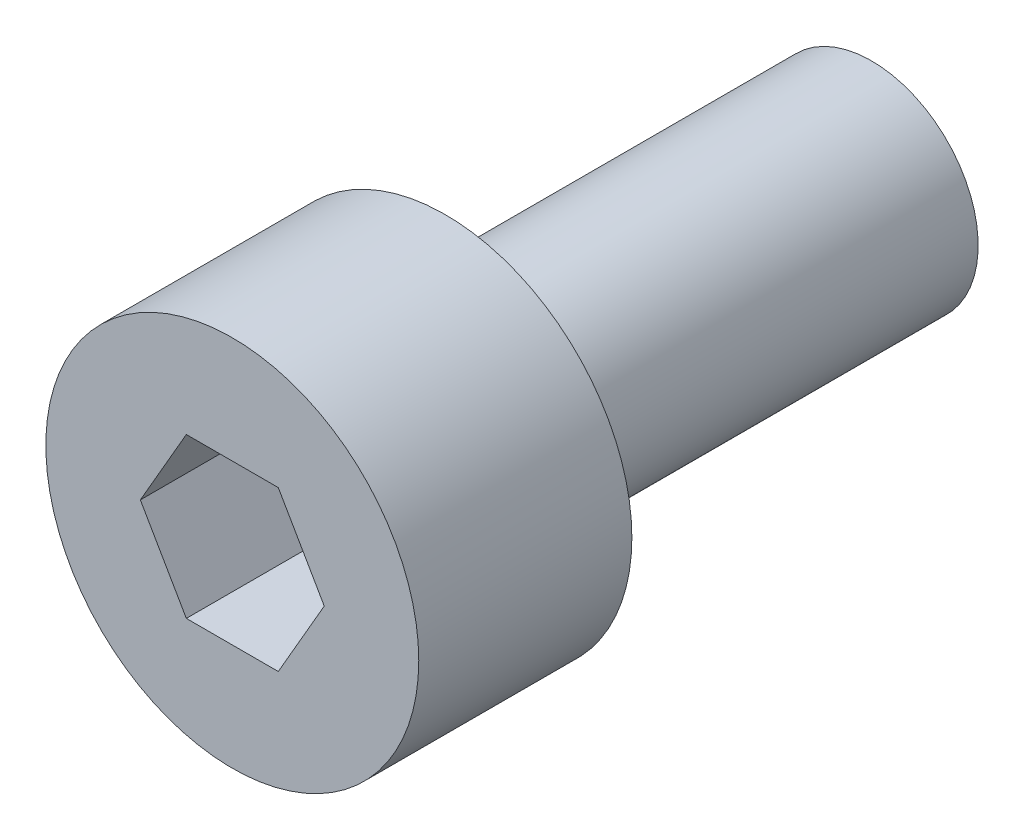
ISO-10303-21;
HEADER;
FILE_DESCRIPTION(('STEP AP214'),'2;1');
FILE_NAME('part.step','',(''),(''),'','','');
FILE_SCHEMA(('AUTOMOTIVE_DESIGN { 1 0 10303 214 1 1 1 1 }'));
ENDSEC;
DATA;
#1=APPLICATION_CONTEXT('core data for automotive mechanical design processes');
#2=APPLICATION_PROTOCOL_DEFINITION('international standard','automotive_design',2000,#1);
#3=PRODUCT_CONTEXT('',#1,'mechanical');
#4=PRODUCT('Part','Part','',(#3));
#5=PRODUCT_RELATED_PRODUCT_CATEGORY('part','',(#4));
#6=PRODUCT_DEFINITION_FORMATION('','',#4);
#7=PRODUCT_DEFINITION_CONTEXT('part definition',#1,'design');
#8=PRODUCT_DEFINITION('design','',#6,#7);
#9=PRODUCT_DEFINITION_SHAPE('','',#8);
#10=(LENGTH_UNIT() NAMED_UNIT(*) SI_UNIT(.MILLI.,.METRE.));
#11=(NAMED_UNIT(*) PLANE_ANGLE_UNIT() SI_UNIT($,.RADIAN.));
#12=(NAMED_UNIT(*) SI_UNIT($,.STERADIAN.) SOLID_ANGLE_UNIT());
#13=UNCERTAINTY_MEASURE_WITH_UNIT(LENGTH_MEASURE(1.E-05),#10,'distance_accuracy_value','');
#14=(GEOMETRIC_REPRESENTATION_CONTEXT(3) GLOBAL_UNCERTAINTY_ASSIGNED_CONTEXT((#13)) GLOBAL_UNIT_ASSIGNED_CONTEXT((#10,
#11,#12)) REPRESENTATION_CONTEXT('',''));
#15=CARTESIAN_POINT('',(0.,0.,0.));
#16=DIRECTION('',(0.,0.,1.));
#17=DIRECTION('',(1.,0.,0.));
#18=AXIS2_PLACEMENT_3D('',#15,#16,#17);
#19=CARTESIAN_POINT('',(0.,-1.49476930499077,4.));
#20=DIRECTION('',(0.,-1.,0.));
#21=DIRECTION('',(0.,0.,-1.));
#22=AXIS2_PLACEMENT_3D('',#19,#20,#21);
#23=PLANE('',#22);
#24=DIRECTION('',(0.,0.,1.));
#25=VECTOR('',#24,1.);
#26=CARTESIAN_POINT('',(-0.863005460612815,-1.49476930499077,4.));
#27=LINE('',#26,#25);
#28=CARTESIAN_POINT('',(-0.863005460612813,-1.49476930499077,1.));
#29=VERTEX_POINT('',#28);
#30=CARTESIAN_POINT('',(-0.863005460612813,-1.49476930499077,4.));
#31=VERTEX_POINT('',#30);
#32=EDGE_CURVE('E80',#29,#31,#27,.T.);
#33=ORIENTED_EDGE('',*,*,#32,.T.);
#34=DIRECTION('',(1.,0.,0.));
#35=VECTOR('',#34,1.);
#36=CARTESIAN_POINT('',(0.,-1.49476930499077,4.));
#37=LINE('',#36,#35);
#38=CARTESIAN_POINT('',(0.863005460612809,-1.49476930499077,4.));
#39=VERTEX_POINT('',#38);
#40=EDGE_CURVE('E70',#39,#31,#37,.F.);
#41=ORIENTED_EDGE('',*,*,#40,.F.);
#42=DIRECTION('',(0.,0.,1.));
#43=VECTOR('',#42,1.);
#44=CARTESIAN_POINT('',(0.863005460612806,-1.49476930499077,4.));
#45=LINE('',#44,#43);
#46=CARTESIAN_POINT('',(0.863005460612809,-1.49476930499077,1.));
#47=VERTEX_POINT('',#46);
#48=EDGE_CURVE('E126',#39,#47,#45,.F.);
#49=ORIENTED_EDGE('',*,*,#48,.T.);
#50=DIRECTION('',(1.,0.,0.));
#51=VECTOR('',#50,1.);
#52=CARTESIAN_POINT('',(0.,-1.49476930499077,1.));
#53=LINE('',#52,#51);
#54=EDGE_CURVE('E66',#29,#47,#53,.T.);
#55=ORIENTED_EDGE('',*,*,#54,.F.);
#56=EDGE_LOOP('',(#33,#41,#49,#55));
#57=FACE_BOUND('',#56,.T.);
#58=ADVANCED_FACE('F16',(#57),#23,.F.);
#59=CARTESIAN_POINT('',(-1.29450819091922,-0.747384652495384,4.));
#60=DIRECTION('',(-0.86602540378444,-0.499999999999998,0.));
#61=DIRECTION('',(0.499999999999998,-0.86602540378444,0.));
#62=AXIS2_PLACEMENT_3D('',#59,#60,#61);
#63=PLANE('',#62);
#64=DIRECTION('',(0.,0.,1.));
#65=VECTOR('',#64,1.);
#66=CARTESIAN_POINT('',(-1.72601092122562,0.,4.));
#67=LINE('',#66,#65);
#68=CARTESIAN_POINT('',(-1.72601092122562,0.,1.));
#69=VERTEX_POINT('',#68);
#70=CARTESIAN_POINT('',(-1.72601092122562,0.,4.));
#71=VERTEX_POINT('',#70);
#72=EDGE_CURVE('E85',#69,#71,#67,.T.);
#73=ORIENTED_EDGE('',*,*,#72,.T.);
#74=DIRECTION('',(0.499999999999998,-0.86602540378444,0.));
#75=VECTOR('',#74,1.);
#76=CARTESIAN_POINT('',(-1.29450819091922,-0.747384652495384,4.));
#77=LINE('',#76,#75);
#78=EDGE_CURVE('E73',#31,#71,#77,.F.);
#79=ORIENTED_EDGE('',*,*,#78,.F.);
#80=ORIENTED_EDGE('',*,*,#32,.F.);
#81=DIRECTION('',(0.499999999999998,-0.86602540378444,0.));
#82=VECTOR('',#81,1.);
#83=CARTESIAN_POINT('',(-1.29450819091922,-0.747384652495384,1.));
#84=LINE('',#83,#82);
#85=EDGE_CURVE('E86',#69,#29,#84,.T.);
#86=ORIENTED_EDGE('',*,*,#85,.F.);
#87=EDGE_LOOP('',(#73,#79,#80,#86));
#88=FACE_BOUND('',#87,.T.);
#89=ADVANCED_FACE('F83',(#88),#63,.F.);
#90=CARTESIAN_POINT('',(1.29450819091921,-0.747384652495385,4.));
#91=DIRECTION('',(0.866025403784439,-0.5,0.));
#92=DIRECTION('',(0.5,0.866025403784439,0.));
#93=AXIS2_PLACEMENT_3D('',#90,#91,#92);
#94=PLANE('',#93);
#95=ORIENTED_EDGE('',*,*,#48,.F.);
#96=DIRECTION('',(0.5,0.866025403784439,0.));
#97=VECTOR('',#96,1.);
#98=CARTESIAN_POINT('',(1.29450819091921,-0.747384652495385,4.));
#99=LINE('',#98,#97);
#100=CARTESIAN_POINT('',(1.72601092122562,0.,4.));
#101=VERTEX_POINT('',#100);
#102=EDGE_CURVE('E76',#101,#39,#99,.F.);
#103=ORIENTED_EDGE('',*,*,#102,.F.);
#104=DIRECTION('',(0.,0.,1.));
#105=VECTOR('',#104,1.);
#106=CARTESIAN_POINT('',(1.72601092122562,0.,4.));
#107=LINE('',#106,#105);
#108=CARTESIAN_POINT('',(1.72601092122562,0.,1.));
#109=VERTEX_POINT('',#108);
#110=EDGE_CURVE('E117',#101,#109,#107,.F.);
#111=ORIENTED_EDGE('',*,*,#110,.T.);
#112=DIRECTION('',(0.5,0.866025403784439,0.));
#113=VECTOR('',#112,1.);
#114=CARTESIAN_POINT('',(1.29450819091921,-0.747384652495385,1.));
#115=LINE('',#114,#113);
#116=EDGE_CURVE('E124',#47,#109,#115,.T.);
#117=ORIENTED_EDGE('',*,*,#116,.F.);
#118=EDGE_LOOP('',(#95,#103,#111,#117));
#119=FACE_BOUND('',#118,.T.);
#120=ADVANCED_FACE('F129',(#119),#94,.F.);
#121=CARTESIAN_POINT('',(-1.29450819091921,0.747384652495386,4.));
#122=DIRECTION('',(-0.866025403784438,0.5,0.));
#123=DIRECTION('',(-0.5,-0.866025403784438,0.));
#124=AXIS2_PLACEMENT_3D('',#121,#122,#123);
#125=PLANE('',#124);
#126=DIRECTION('',(0.,0.,1.));
#127=VECTOR('',#126,1.);
#128=CARTESIAN_POINT('',(-0.863005460612809,1.49476930499077,4.));
#129=LINE('',#128,#127);
#130=CARTESIAN_POINT('',(-0.863005460612807,1.49476930499077,1.));
#131=VERTEX_POINT('',#130);
#132=CARTESIAN_POINT('',(-0.863005460612807,1.49476930499077,4.));
#133=VERTEX_POINT('',#132);
#134=EDGE_CURVE('E109',#131,#133,#129,.T.);
#135=ORIENTED_EDGE('',*,*,#134,.T.);
#136=DIRECTION('',(-0.5,-0.866025403784438,0.));
#137=VECTOR('',#136,1.);
#138=CARTESIAN_POINT('',(-1.29450819091921,0.747384652495386,4.));
#139=LINE('',#138,#137);
#140=EDGE_CURVE('E34',#71,#133,#139,.F.);
#141=ORIENTED_EDGE('',*,*,#140,.F.);
#142=ORIENTED_EDGE('',*,*,#72,.F.);
#143=DIRECTION('',(-0.5,-0.866025403784438,0.));
#144=VECTOR('',#143,1.);
#145=CARTESIAN_POINT('',(-0.863005460612809,1.49476930499077,1.));
#146=LINE('',#145,#144);
#147=EDGE_CURVE('E111',#131,#69,#146,.T.);
#148=ORIENTED_EDGE('',*,*,#147,.F.);
#149=EDGE_LOOP('',(#135,#141,#142,#148));
#150=FACE_BOUND('',#149,.T.);
#151=ADVANCED_FACE('F136',(#150),#125,.F.);
#152=CARTESIAN_POINT('',(1.29450819091921,0.747384652495385,4.));
#153=DIRECTION('',(0.866025403784439,0.499999999999999,0.));
#154=DIRECTION('',(-0.499999999999999,0.866025403784439,0.));
#155=AXIS2_PLACEMENT_3D('',#152,#153,#154);
#156=PLANE('',#155);
#157=ORIENTED_EDGE('',*,*,#110,.F.);
#158=DIRECTION('',(-0.499999999999999,0.866025403784439,0.));
#159=VECTOR('',#158,1.);
#160=CARTESIAN_POINT('',(1.29450819091921,0.747384652495385,4.));
#161=LINE('',#160,#159);
#162=CARTESIAN_POINT('',(0.863005460612808,1.49476930499077,4.));
#163=VERTEX_POINT('',#162);
#164=EDGE_CURVE('E120',#163,#101,#161,.F.);
#165=ORIENTED_EDGE('',*,*,#164,.F.);
#166=DIRECTION('',(0.,0.,1.));
#167=VECTOR('',#166,1.);
#168=CARTESIAN_POINT('',(0.86300546061281,1.49476930499077,4.));
#169=LINE('',#168,#167);
#170=CARTESIAN_POINT('',(0.863005460612808,1.49476930499077,1.));
#171=VERTEX_POINT('',#170);
#172=EDGE_CURVE('E105',#163,#171,#169,.F.);
#173=ORIENTED_EDGE('',*,*,#172,.T.);
#174=DIRECTION('',(-0.499999999999999,0.866025403784439,0.));
#175=VECTOR('',#174,1.);
#176=CARTESIAN_POINT('',(1.72601092122562,0.,1.));
#177=LINE('',#176,#175);
#178=EDGE_CURVE('E114',#109,#171,#177,.T.);
#179=ORIENTED_EDGE('',*,*,#178,.F.);
#180=EDGE_LOOP('',(#157,#165,#173,#179));
#181=FACE_BOUND('',#180,.T.);
#182=ADVANCED_FACE('F142',(#181),#156,.F.);
#183=CARTESIAN_POINT('',(0.,0.,1.));
#184=DIRECTION('',(0.,0.,1.));
#185=DIRECTION('',(1.,0.,0.));
#186=AXIS2_PLACEMENT_3D('',#183,#184,#185);
#187=PLANE('',#186);
#188=ORIENTED_EDGE('',*,*,#54,.T.);
#189=ORIENTED_EDGE('',*,*,#116,.T.);
#190=ORIENTED_EDGE('',*,*,#178,.T.);
#191=DIRECTION('',(1.,0.,0.));
#192=VECTOR('',#191,1.);
#193=CARTESIAN_POINT('',(0.,1.49476930499077,1.));
#194=LINE('',#193,#192);
#195=EDGE_CURVE('E101',#171,#131,#194,.F.);
#196=ORIENTED_EDGE('',*,*,#195,.T.);
#197=ORIENTED_EDGE('',*,*,#147,.T.);
#198=ORIENTED_EDGE('',*,*,#85,.T.);
#199=EDGE_LOOP('',(#188,#189,#190,#196,#197,#198));
#200=FACE_BOUND('',#199,.T.);
#201=ADVANCED_FACE('F133',(#200),#187,.T.);
#202=CARTESIAN_POINT('',(0.,1.49476930499077,4.));
#203=DIRECTION('',(0.,1.,0.));
#204=DIRECTION('',(0.,0.,1.));
#205=AXIS2_PLACEMENT_3D('',#202,#203,#204);
#206=PLANE('',#205);
#207=ORIENTED_EDGE('',*,*,#172,.F.);
#208=DIRECTION('',(1.,0.,0.));
#209=VECTOR('',#208,1.);
#210=CARTESIAN_POINT('',(0.,1.49476930499077,4.));
#211=LINE('',#210,#209);
#212=EDGE_CURVE('E98',#133,#163,#211,.T.);
#213=ORIENTED_EDGE('',*,*,#212,.F.);
#214=ORIENTED_EDGE('',*,*,#134,.F.);
#215=ORIENTED_EDGE('',*,*,#195,.F.);
#216=EDGE_LOOP('',(#207,#213,#214,#215));
#217=FACE_BOUND('',#216,.T.);
#218=ADVANCED_FACE('F140',(#217),#206,.F.);
#219=CARTESIAN_POINT('',(0.,0.,4.));
#220=DIRECTION('',(0.,0.,1.));
#221=DIRECTION('',(1.,0.,0.));
#222=AXIS2_PLACEMENT_3D('',#219,#220,#221);
#223=PLANE('',#222);
#224=CARTESIAN_POINT('',(0.,0.,4.));
#225=DIRECTION('',(0.,0.,1.));
#226=DIRECTION('',(1.,0.,0.));
#227=AXIS2_PLACEMENT_3D('',#224,#225,#226);
#228=CIRCLE('',#227,3.5);
#229=CARTESIAN_POINT('',(3.5,0.,4.));
#230=VERTEX_POINT('',#229);
#231=EDGE_CURVE('E19',#230,#230,#228,.F.);
#232=ORIENTED_EDGE('',*,*,#231,.F.);
#233=EDGE_LOOP('',(#232));
#234=FACE_BOUND('',#233,.T.);
#235=ORIENTED_EDGE('',*,*,#140,.T.);
#236=ORIENTED_EDGE('',*,*,#212,.T.);
#237=ORIENTED_EDGE('',*,*,#164,.T.);
#238=ORIENTED_EDGE('',*,*,#102,.T.);
#239=ORIENTED_EDGE('',*,*,#40,.T.);
#240=ORIENTED_EDGE('',*,*,#78,.T.);
#241=EDGE_LOOP('',(#235,#236,#237,#238,#239,#240));
#242=FACE_BOUND('',#241,.T.);
#243=ADVANCED_FACE('F71',(#234,#242),#223,.T.);
#244=CARTESIAN_POINT('',(0.,0.,0.));
#245=DIRECTION('',(0.,0.,1.));
#246=DIRECTION('',(1.,0.,0.));
#247=AXIS2_PLACEMENT_3D('',#244,#245,#246);
#248=CYLINDRICAL_SURFACE('',#247,3.5);
#249=CARTESIAN_POINT('',(0.,0.,0.));
#250=DIRECTION('',(0.,0.,1.));
#251=DIRECTION('',(1.,0.,0.));
#252=AXIS2_PLACEMENT_3D('',#249,#250,#251);
#253=CIRCLE('',#252,3.5);
#254=CARTESIAN_POINT('',(3.5,0.,0.));
#255=VERTEX_POINT('',#254);
#256=EDGE_CURVE('E93',#255,#255,#253,.T.);
#257=ORIENTED_EDGE('',*,*,#256,.T.);
#258=EDGE_LOOP('',(#257));
#259=FACE_BOUND('',#258,.T.);
#260=ORIENTED_EDGE('',*,*,#231,.T.);
#261=EDGE_LOOP('',(#260));
#262=FACE_BOUND('',#261,.T.);
#263=ADVANCED_FACE('F167',(#259,#262),#248,.T.);
#264=CARTESIAN_POINT('',(0.,0.,-8.));
#265=DIRECTION('',(0.,0.,-1.));
#266=DIRECTION('',(-1.,0.,0.));
#267=AXIS2_PLACEMENT_3D('',#264,#265,#266);
#268=PLANE('',#267);
#269=CARTESIAN_POINT('',(0.,0.,-8.));
#270=DIRECTION('',(0.,0.,-1.));
#271=DIRECTION('',(-1.,0.,0.));
#272=AXIS2_PLACEMENT_3D('',#269,#270,#271);
#273=CIRCLE('',#272,2.);
#274=CARTESIAN_POINT('',(-2.,0.,-8.));
#275=VERTEX_POINT('',#274);
#276=EDGE_CURVE('E25',#275,#275,#273,.F.);
#277=ORIENTED_EDGE('',*,*,#276,.F.);
#278=EDGE_LOOP('',(#277));
#279=FACE_BOUND('',#278,.T.);
#280=ADVANCED_FACE('F160',(#279),#268,.T.);
#281=CARTESIAN_POINT('',(0.,0.,0.));
#282=DIRECTION('',(0.,0.,1.));
#283=DIRECTION('',(1.,0.,0.));
#284=AXIS2_PLACEMENT_3D('',#281,#282,#283);
#285=PLANE('',#284);
#286=ORIENTED_EDGE('',*,*,#256,.F.);
#287=EDGE_LOOP('',(#286));
#288=FACE_BOUND('',#287,.T.);
#289=CARTESIAN_POINT('',(0.,0.,0.));
#290=DIRECTION('',(0.,0.,-1.));
#291=DIRECTION('',(-1.,0.,0.));
#292=AXIS2_PLACEMENT_3D('',#289,#290,#291);
#293=CIRCLE('',#292,2.);
#294=CARTESIAN_POINT('',(-2.,0.,0.));
#295=VERTEX_POINT('',#294);
#296=EDGE_CURVE('E11',#295,#295,#293,.T.);
#297=ORIENTED_EDGE('',*,*,#296,.F.);
#298=EDGE_LOOP('',(#297));
#299=FACE_BOUND('',#298,.T.);
#300=ADVANCED_FACE('F154',(#288,#299),#285,.F.);
#301=CARTESIAN_POINT('',(0.,0.,0.));
#302=DIRECTION('',(0.,0.,-1.));
#303=DIRECTION('',(-1.,0.,0.));
#304=AXIS2_PLACEMENT_3D('',#301,#302,#303);
#305=CYLINDRICAL_SURFACE('',#304,2.);
#306=ORIENTED_EDGE('',*,*,#296,.T.);
#307=EDGE_LOOP('',(#306));
#308=FACE_BOUND('',#307,.T.);
#309=ORIENTED_EDGE('',*,*,#276,.T.);
#310=EDGE_LOOP('',(#309));
#311=FACE_BOUND('',#310,.T.);
#312=ADVANCED_FACE('F152',(#308,#311),#305,.T.);
#313=CLOSED_SHELL('',(#58,#89,#120,#151,#182,#201,#218,#243,#263,#280,#300,#312));
#314=MANIFOLD_SOLID_BREP('B1',#313);
#315=ADVANCED_BREP_SHAPE_REPRESENTATION('',(#18,#314),#14);
#316=SHAPE_DEFINITION_REPRESENTATION(#9,#315);
ENDSEC;
END-ISO-10303-21;
